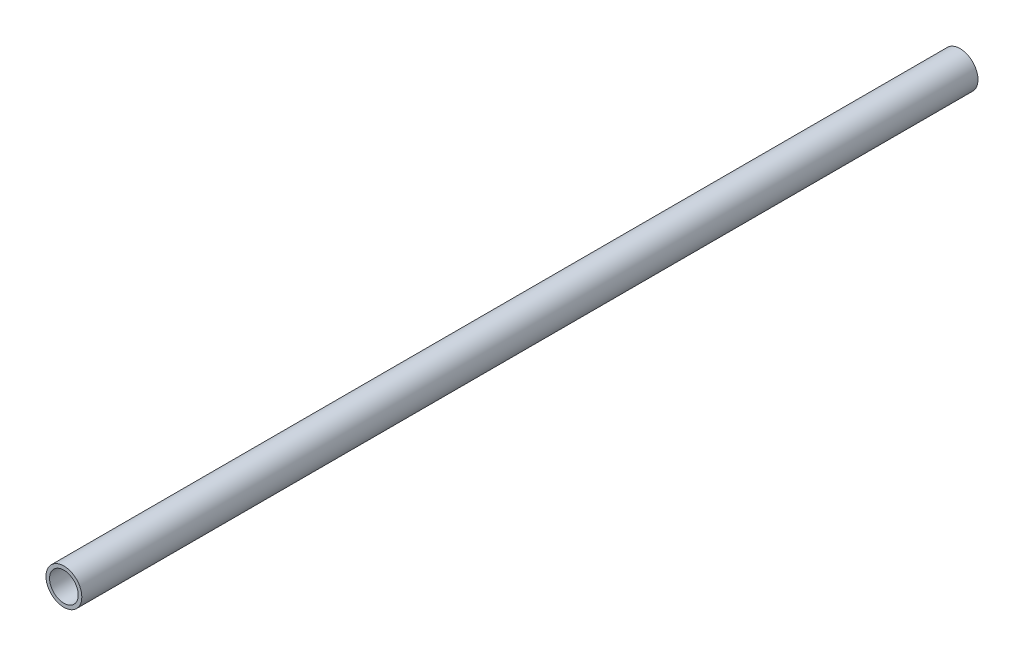
ISO-10303-21;
HEADER;
FILE_DESCRIPTION(('STEP AP214'),'2;1');
FILE_NAME('part.step','',(''),(''),'','','');
FILE_SCHEMA(('AUTOMOTIVE_DESIGN { 1 0 10303 214 1 1 1 1 }'));
ENDSEC;
DATA;
#1=APPLICATION_CONTEXT('core data for automotive mechanical design processes');
#2=APPLICATION_PROTOCOL_DEFINITION('international standard','automotive_design',2000,#1);
#3=PRODUCT_CONTEXT('',#1,'mechanical');
#4=PRODUCT('Part','Part','',(#3));
#5=PRODUCT_RELATED_PRODUCT_CATEGORY('part','',(#4));
#6=PRODUCT_DEFINITION_FORMATION('','',#4);
#7=PRODUCT_DEFINITION_CONTEXT('part definition',#1,'design');
#8=PRODUCT_DEFINITION('design','',#6,#7);
#9=PRODUCT_DEFINITION_SHAPE('','',#8);
#10=(LENGTH_UNIT() NAMED_UNIT(*) SI_UNIT(.MILLI.,.METRE.));
#11=(NAMED_UNIT(*) PLANE_ANGLE_UNIT() SI_UNIT($,.RADIAN.));
#12=(NAMED_UNIT(*) SI_UNIT($,.STERADIAN.) SOLID_ANGLE_UNIT());
#13=UNCERTAINTY_MEASURE_WITH_UNIT(LENGTH_MEASURE(1.E-05),#10,'distance_accuracy_value','');
#14=(GEOMETRIC_REPRESENTATION_CONTEXT(3) GLOBAL_UNCERTAINTY_ASSIGNED_CONTEXT((#13)) GLOBAL_UNIT_ASSIGNED_CONTEXT((#10,
#11,#12)) REPRESENTATION_CONTEXT('',''));
#15=CARTESIAN_POINT('',(0.,0.,0.));
#16=DIRECTION('',(0.,0.,1.));
#17=DIRECTION('',(1.,0.,0.));
#18=AXIS2_PLACEMENT_3D('',#15,#16,#17);
#19=CARTESIAN_POINT('',(0.,0.,250.));
#20=DIRECTION('',(0.,0.,1.));
#21=DIRECTION('',(1.,0.,0.));
#22=AXIS2_PLACEMENT_3D('',#19,#20,#21);
#23=PLANE('',#22);
#24=CARTESIAN_POINT('',(0.,0.,250.));
#25=DIRECTION('',(0.,0.,1.));
#26=DIRECTION('',(1.,0.,0.));
#27=AXIS2_PLACEMENT_3D('',#24,#25,#26);
#28=CIRCLE('',#27,5.);
#29=CARTESIAN_POINT('',(5.,0.,250.));
#30=VERTEX_POINT('',#29);
#31=EDGE_CURVE('E10',#30,#30,#28,.T.);
#32=ORIENTED_EDGE('',*,*,#31,.T.);
#33=EDGE_LOOP('',(#32));
#34=FACE_BOUND('',#33,.T.);
#35=CARTESIAN_POINT('',(0.,0.,250.));
#36=DIRECTION('',(0.,0.,1.));
#37=DIRECTION('',(1.,0.,0.));
#38=AXIS2_PLACEMENT_3D('',#35,#36,#37);
#39=CIRCLE('',#38,4.);
#40=CARTESIAN_POINT('',(4.,0.,250.));
#41=VERTEX_POINT('',#40);
#42=EDGE_CURVE('E42',#41,#41,#39,.T.);
#43=ORIENTED_EDGE('',*,*,#42,.F.);
#44=EDGE_LOOP('',(#43));
#45=FACE_BOUND('',#44,.T.);
#46=ADVANCED_FACE('F31',(#34,#45),#23,.T.);
#47=CARTESIAN_POINT('',(0.,0.,0.));
#48=DIRECTION('',(0.,0.,1.));
#49=DIRECTION('',(1.,0.,0.));
#50=AXIS2_PLACEMENT_3D('',#47,#48,#49);
#51=PLANE('',#50);
#52=CARTESIAN_POINT('',(0.,0.,0.));
#53=DIRECTION('',(0.,0.,1.));
#54=DIRECTION('',(1.,0.,0.));
#55=AXIS2_PLACEMENT_3D('',#52,#53,#54);
#56=CIRCLE('',#55,5.);
#57=CARTESIAN_POINT('',(5.,0.,0.));
#58=VERTEX_POINT('',#57);
#59=EDGE_CURVE('E35',#58,#58,#56,.T.);
#60=ORIENTED_EDGE('',*,*,#59,.F.);
#61=EDGE_LOOP('',(#60));
#62=FACE_BOUND('',#61,.T.);
#63=CARTESIAN_POINT('',(0.,0.,0.));
#64=DIRECTION('',(0.,0.,1.));
#65=DIRECTION('',(1.,0.,0.));
#66=AXIS2_PLACEMENT_3D('',#63,#64,#65);
#67=CIRCLE('',#66,4.);
#68=CARTESIAN_POINT('',(4.,0.,0.));
#69=VERTEX_POINT('',#68);
#70=EDGE_CURVE('E44',#69,#69,#67,.T.);
#71=ORIENTED_EDGE('',*,*,#70,.T.);
#72=EDGE_LOOP('',(#71));
#73=FACE_BOUND('',#72,.T.);
#74=ADVANCED_FACE('F54',(#62,#73),#51,.F.);
#75=CARTESIAN_POINT('',(0.,0.,250.));
#76=DIRECTION('',(0.,0.,-1.));
#77=DIRECTION('',(-1.,0.,0.));
#78=AXIS2_PLACEMENT_3D('',#75,#76,#77);
#79=CYLINDRICAL_SURFACE('',#78,5.);
#80=ORIENTED_EDGE('',*,*,#31,.F.);
#81=EDGE_LOOP('',(#80));
#82=FACE_BOUND('',#81,.T.);
#83=ORIENTED_EDGE('',*,*,#59,.T.);
#84=EDGE_LOOP('',(#83));
#85=FACE_BOUND('',#84,.T.);
#86=ADVANCED_FACE('F33',(#82,#85),#79,.T.);
#87=CARTESIAN_POINT('',(0.,0.,250.));
#88=DIRECTION('',(0.,0.,-1.));
#89=DIRECTION('',(-1.,0.,0.));
#90=AXIS2_PLACEMENT_3D('',#87,#88,#89);
#91=CYLINDRICAL_SURFACE('',#90,4.);
#92=ORIENTED_EDGE('',*,*,#42,.T.);
#93=EDGE_LOOP('',(#92));
#94=FACE_BOUND('',#93,.T.);
#95=ORIENTED_EDGE('',*,*,#70,.F.);
#96=EDGE_LOOP('',(#95));
#97=FACE_BOUND('',#96,.T.);
#98=ADVANCED_FACE('F50',(#94,#97),#91,.F.);
#99=CLOSED_SHELL('',(#46,#74,#86,#98));
#100=MANIFOLD_SOLID_BREP('B2',#99);
#101=ADVANCED_BREP_SHAPE_REPRESENTATION('',(#18,#100),#14);
#102=SHAPE_DEFINITION_REPRESENTATION(#9,#101);
ENDSEC;
END-ISO-10303-21;
